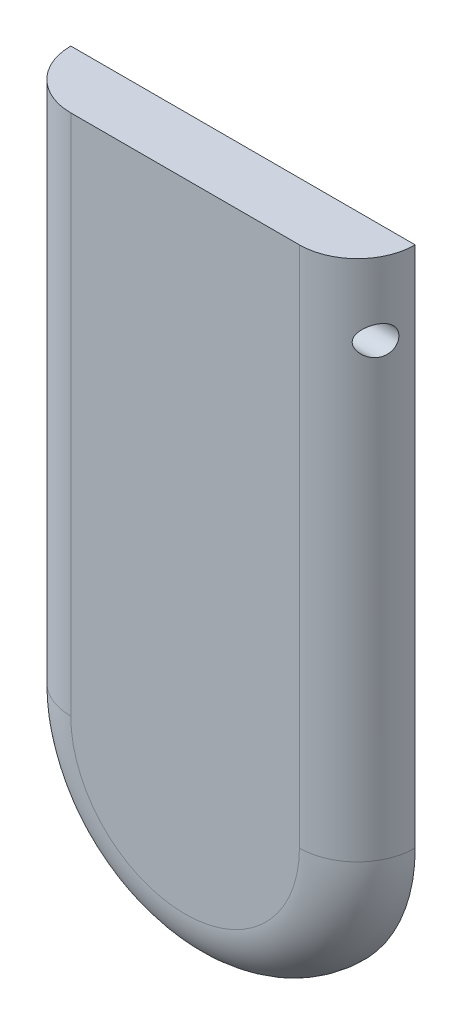
ISO-10303-21;
HEADER;
FILE_DESCRIPTION(('STEP AP214'),'2;1');
FILE_NAME('part.step','',(''),(''),'','','');
FILE_SCHEMA(('AUTOMOTIVE_DESIGN { 1 0 10303 214 1 1 1 1 }'));
ENDSEC;
DATA;
#1=APPLICATION_CONTEXT('core data for automotive mechanical design processes');
#2=APPLICATION_PROTOCOL_DEFINITION('international standard','automotive_design',2000,#1);
#3=PRODUCT_CONTEXT('',#1,'mechanical');
#4=PRODUCT('Part','Part','',(#3));
#5=PRODUCT_RELATED_PRODUCT_CATEGORY('part','',(#4));
#6=PRODUCT_DEFINITION_FORMATION('','',#4);
#7=PRODUCT_DEFINITION_CONTEXT('part definition',#1,'design');
#8=PRODUCT_DEFINITION('design','',#6,#7);
#9=PRODUCT_DEFINITION_SHAPE('','',#8);
#10=(LENGTH_UNIT() NAMED_UNIT(*) SI_UNIT(.MILLI.,.METRE.));
#11=(NAMED_UNIT(*) PLANE_ANGLE_UNIT() SI_UNIT($,.RADIAN.));
#12=(NAMED_UNIT(*) SI_UNIT($,.STERADIAN.) SOLID_ANGLE_UNIT());
#13=UNCERTAINTY_MEASURE_WITH_UNIT(LENGTH_MEASURE(1.E-05),#10,'distance_accuracy_value','');
#14=(GEOMETRIC_REPRESENTATION_CONTEXT(3) GLOBAL_UNCERTAINTY_ASSIGNED_CONTEXT((#13)) GLOBAL_UNIT_ASSIGNED_CONTEXT((#10,
#11,#12)) REPRESENTATION_CONTEXT('',''));
#15=CARTESIAN_POINT('',(0.,0.,0.));
#16=DIRECTION('',(0.,0.,1.));
#17=DIRECTION('',(1.,0.,0.));
#18=AXIS2_PLACEMENT_3D('',#15,#16,#17);
#19=CARTESIAN_POINT('',(0.,0.,10.));
#20=DIRECTION('',(0.,1.,0.));
#21=DIRECTION('',(-1.,0.,0.));
#22=AXIS2_PLACEMENT_3D('',#19,#20,#21);
#23=PLANE('',#22);
#24=DIRECTION('',(1.,0.,0.));
#25=VECTOR('',#24,1.);
#26=CARTESIAN_POINT('',(0.,0.,0.));
#27=LINE('',#26,#25);
#28=CARTESIAN_POINT('',(0.,0.,0.));
#29=VERTEX_POINT('',#28);
#30=CARTESIAN_POINT('',(59.5,0.,0.));
#31=VERTEX_POINT('',#30);
#32=EDGE_CURVE('E84',#29,#31,#27,.T.);
#33=ORIENTED_EDGE('',*,*,#32,.F.);
#34=CARTESIAN_POINT('',(10.,0.,0.));
#35=DIRECTION('',(0.,1.,0.));
#36=DIRECTION('',(-1.,0.,0.));
#37=AXIS2_PLACEMENT_3D('',#34,#35,#36);
#38=CIRCLE('',#37,10.);
#39=CARTESIAN_POINT('',(10.,0.,10.));
#40=VERTEX_POINT('',#39);
#41=EDGE_CURVE('E11',#29,#40,#38,.T.);
#42=ORIENTED_EDGE('',*,*,#41,.T.);
#43=DIRECTION('',(1.,0.,0.));
#44=VECTOR('',#43,1.);
#45=CARTESIAN_POINT('',(0.,0.,10.));
#46=LINE('',#45,#44);
#47=CARTESIAN_POINT('',(49.5,0.,10.));
#48=VERTEX_POINT('',#47);
#49=EDGE_CURVE('E87',#40,#48,#46,.T.);
#50=ORIENTED_EDGE('',*,*,#49,.T.);
#51=CARTESIAN_POINT('',(49.5,0.,0.));
#52=DIRECTION('',(0.,1.,0.));
#53=DIRECTION('',(-1.,0.,0.));
#54=AXIS2_PLACEMENT_3D('',#51,#52,#53);
#55=CIRCLE('',#54,10.);
#56=EDGE_CURVE('E47',#48,#31,#55,.T.);
#57=ORIENTED_EDGE('',*,*,#56,.T.);
#58=EDGE_LOOP('',(#33,#42,#50,#57));
#59=FACE_BOUND('',#58,.T.);
#60=ADVANCED_FACE('F33',(#59),#23,.T.);
#61=CARTESIAN_POINT('',(29.75,-90.25,10.));
#62=DIRECTION('',(0.,0.,1.));
#63=DIRECTION('',(1.,0.,0.));
#64=AXIS2_PLACEMENT_3D('',#61,#62,#63);
#65=PLANE('',#64);
#66=ORIENTED_EDGE('',*,*,#49,.F.);
#67=DIRECTION('',(0.,-1.,0.));
#68=VECTOR('',#67,1.);
#69=CARTESIAN_POINT('',(10.,-90.25,10.));
#70=LINE('',#69,#68);
#71=CARTESIAN_POINT('',(10.,-90.25,10.));
#72=VERTEX_POINT('',#71);
#73=EDGE_CURVE('E90',#40,#72,#70,.T.);
#74=ORIENTED_EDGE('',*,*,#73,.T.);
#75=CARTESIAN_POINT('',(29.75,-90.25,10.));
#76=DIRECTION('',(0.,0.,1.));
#77=DIRECTION('',(1.,0.,0.));
#78=AXIS2_PLACEMENT_3D('',#75,#76,#77);
#79=CIRCLE('',#78,19.75);
#80=CARTESIAN_POINT('',(49.5,-90.25,10.));
#81=VERTEX_POINT('',#80);
#82=EDGE_CURVE('E55',#72,#81,#79,.T.);
#83=ORIENTED_EDGE('',*,*,#82,.T.);
#84=DIRECTION('',(0.,-1.,0.));
#85=VECTOR('',#84,1.);
#86=CARTESIAN_POINT('',(49.5,-90.25,10.));
#87=LINE('',#86,#85);
#88=EDGE_CURVE('E110',#81,#48,#87,.F.);
#89=ORIENTED_EDGE('',*,*,#88,.T.);
#90=EDGE_LOOP('',(#66,#74,#83,#89));
#91=FACE_BOUND('',#90,.T.);
#92=ADVANCED_FACE('F134',(#91),#65,.T.);
#93=CARTESIAN_POINT('',(29.75,-90.25,0.));
#94=DIRECTION('',(0.,0.,1.));
#95=DIRECTION('',(1.,0.,0.));
#96=AXIS2_PLACEMENT_3D('',#93,#94,#95);
#97=PLANE('',#96);
#98=ORIENTED_EDGE('',*,*,#32,.T.);
#99=DIRECTION('',(0.,-1.,0.));
#100=VECTOR('',#99,1.);
#101=CARTESIAN_POINT('',(59.5,0.,0.));
#102=LINE('',#101,#100);
#103=CARTESIAN_POINT('',(59.5,-90.25,0.));
#104=VERTEX_POINT('',#103);
#105=EDGE_CURVE('E94',#31,#104,#102,.T.);
#106=ORIENTED_EDGE('',*,*,#105,.T.);
#107=CARTESIAN_POINT('',(29.75,-90.25,0.));
#108=DIRECTION('',(0.,0.,1.));
#109=DIRECTION('',(1.,0.,0.));
#110=AXIS2_PLACEMENT_3D('',#107,#108,#109);
#111=CIRCLE('',#110,29.75);
#112=CARTESIAN_POINT('',(0.,-90.25,0.));
#113=VERTEX_POINT('',#112);
#114=EDGE_CURVE('E103',#113,#104,#111,.T.);
#115=ORIENTED_EDGE('',*,*,#114,.F.);
#116=DIRECTION('',(0.,-1.,0.));
#117=VECTOR('',#116,1.);
#118=CARTESIAN_POINT('',(0.,0.,0.));
#119=LINE('',#118,#117);
#120=EDGE_CURVE('E96',#29,#113,#119,.T.);
#121=ORIENTED_EDGE('',*,*,#120,.F.);
#122=EDGE_LOOP('',(#98,#106,#115,#121));
#123=FACE_BOUND('',#122,.T.);
#124=ADVANCED_FACE('F93',(#123),#97,.F.);
#125=CARTESIAN_POINT('',(0.,-12.5,5.));
#126=DIRECTION('',(1.,0.,0.));
#127=DIRECTION('',(0.,1.,0.));
#128=AXIS2_PLACEMENT_3D('',#125,#126,#127);
#129=CYLINDRICAL_SURFACE('',#128,2.5);
#130=CARTESIAN_POINT('',(1.05987940679482,-14.945413246782,4.48042897264856));
#131=CARTESIAN_POINT('',(0.994028148303123,-14.91748824207,4.34902336259244));
#132=CARTESIAN_POINT('',(0.931983525336891,-14.8785391542313,4.21792886358789));
#133=CARTESIAN_POINT('',(0.816653598511713,-14.7778664839156,3.96056446968517));
#134=CARTESIAN_POINT('',(0.76337379755164,-14.7161286720802,3.83429764368121));
#135=CARTESIAN_POINT('',(0.666078025049096,-14.5699887235298,3.59097949836302));
#136=CARTESIAN_POINT('',(0.622092928464721,-14.4855131056338,3.47395967699344));
#137=CARTESIAN_POINT('',(0.543709069300681,-14.2956799201381,3.25456064041705));
#138=CARTESIAN_POINT('',(0.509307143647473,-14.1903292623621,3.15217659988965));
#139=CARTESIAN_POINT('',(0.451461646834753,-13.9686962968049,2.97217687890514));
#140=CARTESIAN_POINT('',(0.42747875515732,-13.85346886237,2.89343335168152));
#141=CARTESIAN_POINT('',(0.386960892698124,-13.6105047131829,2.75583863781248));
#142=CARTESIAN_POINT('',(0.370424882511313,-13.4827697472122,2.69698467534988));
#143=CARTESIAN_POINT('',(0.344554484486388,-13.22258245721,2.60282480959812));
#144=CARTESIAN_POINT('',(0.335019759904709,-13.0903849642254,2.56686810723234));
#145=CARTESIAN_POINT('',(0.321914407376719,-12.8216093066468,2.51700878098144));
#146=CARTESIAN_POINT('',(0.318343470728219,-12.6850313691698,2.50310501557705));
#147=CARTESIAN_POINT('',(0.316983485857283,-12.4121108273717,2.497838687993));
#148=CARTESIAN_POINT('',(0.31916516987436,-12.275770549721,2.50636202240123));
#149=CARTESIAN_POINT('',(0.329361784454931,-12.0065049557678,2.54541894949884));
#150=CARTESIAN_POINT('',(0.337376609416507,-11.8735795776878,2.57595214372639));
#151=CARTESIAN_POINT('',(0.359619406360098,-11.6149345791403,2.65797918841548));
#152=CARTESIAN_POINT('',(0.373846395876188,-11.4892138228032,2.70946972434525));
#153=CARTESIAN_POINT('',(0.409064633211984,-11.2484928185443,2.83160341378108));
#154=CARTESIAN_POINT('',(0.430055538355111,-11.1334920279032,2.90224559698888));
#155=CARTESIAN_POINT('',(0.479447787841247,-10.9169944210125,3.06038273780677));
#156=CARTESIAN_POINT('',(0.507870931672704,-10.8155386785496,3.14792707009057));
#157=CARTESIAN_POINT('',(0.572516883612841,-10.6290418780168,3.33653704159116));
#158=CARTESIAN_POINT('',(0.608739779478413,-10.544001004655,3.43760283293632));
#159=CARTESIAN_POINT('',(0.68991253245484,-10.3904833790493,3.65179762578683));
#160=CARTESIAN_POINT('',(0.735023143238465,-10.3223738574949,3.76512823999753));
#161=CARTESIAN_POINT('',(0.83319886592286,-10.2057826337408,3.99821898318103));
#162=CARTESIAN_POINT('',(0.886265754828174,-10.1573053252963,4.11798054463645));
#163=CARTESIAN_POINT('',(1.003229276085,-10.0774645702766,4.36787104181132));
#164=CARTESIAN_POINT('',(1.06759552029235,-10.0473603554445,4.49818006997711));
#165=CARTESIAN_POINT('',(1.20337335628127,-10.0082387308599,4.75824772137468));
#166=CARTESIAN_POINT('',(1.27478775855123,-9.99922976863908,4.88800610334717));
#167=CARTESIAN_POINT('',(1.43207886924341,-10.000970696237,5.15927413545926));
#168=CARTESIAN_POINT('',(1.5186663506097,-10.0141902142027,5.30035273676415));
#169=CARTESIAN_POINT('',(1.69680875396729,-10.0630828745267,5.57529547932706));
#170=CARTESIAN_POINT('',(1.78836697361786,-10.0987710934641,5.70915471083376));
#171=CARTESIAN_POINT('',(1.98813612133499,-10.1976475692352,5.98694322010017));
#172=CARTESIAN_POINT('',(2.09678713244677,-10.2641543659196,6.12937740006683));
#173=CARTESIAN_POINT('',(2.31397771048377,-10.4225895596824,6.39961885732443));
#174=CARTESIAN_POINT('',(2.42251716347666,-10.5145340070112,6.52741682746511));
#175=CARTESIAN_POINT('',(2.62167033882209,-10.7104887250239,6.75128950188052));
#176=CARTESIAN_POINT('',(2.71285769381814,-10.8116673347857,6.84933215205894));
#177=CARTESIAN_POINT('',(2.88672743788656,-11.033500687585,7.0297186775906));
#178=CARTESIAN_POINT('',(2.96942466096719,-11.1541204811169,7.11209015626536));
#179=CARTESIAN_POINT('',(3.09674416168973,-11.375711577517,7.23535895153976));
#180=CARTESIAN_POINT('',(3.14532121918584,-11.4716088379738,7.28126778539937));
#181=CARTESIAN_POINT('',(3.23167226410124,-11.6726589786864,7.36160397699545));
#182=CARTESIAN_POINT('',(3.2694635482878,-11.7777966821001,7.39604973256839));
#183=CARTESIAN_POINT('',(3.32548792554142,-11.9776390647438,7.44661558712308));
#184=CARTESIAN_POINT('',(3.34592404035388,-12.0711863198266,7.46482633607299));
#185=CARTESIAN_POINT('',(3.3747803759506,-12.2615578500406,7.4904506181837));
#186=CARTESIAN_POINT('',(3.38321061078104,-12.3583793250626,7.49787314985059));
#187=CARTESIAN_POINT('',(3.38713619864913,-12.5526968152861,7.50133604498708));
#188=CARTESIAN_POINT('',(3.3826051421731,-12.6501938033428,7.49735316914448));
#189=CARTESIAN_POINT('',(3.36107564177232,-12.8426933094326,7.47829375592313));
#190=CARTESIAN_POINT('',(3.34406842351159,-12.9376940231346,7.46320941098918));
#191=CARTESIAN_POINT('',(3.29477734159391,-13.1414629225742,7.41898089318143));
#192=CARTESIAN_POINT('',(3.26011147241057,-13.2491645581498,7.38762153061496));
#193=CARTESIAN_POINT('',(3.17900099000379,-13.4555518726077,7.31279782273326));
#194=CARTESIAN_POINT('',(3.13253342780209,-13.554219469863,7.26930987643161));
#195=CARTESIAN_POINT('',(3.01135028981312,-13.7788371629884,7.15319913650021));
#196=CARTESIAN_POINT('',(2.93272018811096,-13.9002092365847,7.07584918386866));
#197=CARTESIAN_POINT('',(2.76634934809232,-14.1242510524074,6.90568821449608));
#198=CARTESIAN_POINT('',(2.6785979764923,-14.2268985734432,6.81285907472509));
#199=CARTESIAN_POINT('',(2.4956405778684,-14.4170028843438,6.61088170991247));
#200=CARTESIAN_POINT('',(2.40028423382981,-14.503848245689,6.50129681183536));
#201=CARTESIAN_POINT('',(2.20835219276505,-14.6578743007818,6.26999628845262));
#202=CARTESIAN_POINT('',(2.11177587020162,-14.7250444406439,6.14827419944749));
#203=CARTESIAN_POINT('',(1.89938701680508,-14.8510917051919,5.86664411543181));
#204=CARTESIAN_POINT('',(1.78395457571379,-14.9049952746945,5.70418585815381));
#205=CARTESIAN_POINT('',(1.56009015685605,-14.9788338952371,5.36736123399828));
#206=CARTESIAN_POINT('',(1.45164344269154,-14.9988428659317,5.19302164541559));
#207=CARTESIAN_POINT('',(1.29760056295837,-15.0005026993657,4.92734658016539));
#208=CARTESIAN_POINT('',(1.24782830531054,-14.9963851379232,4.83836899912461));
#209=CARTESIAN_POINT('',(1.15140773061797,-14.9783564980051,4.65968911189588));
#210=CARTESIAN_POINT('',(1.10475949094284,-14.9644451770749,4.56998678782053));
#211=CARTESIAN_POINT('',(1.05987940679482,-14.945413246782,4.48042897264856));
#212=B_SPLINE_CURVE_WITH_KNOTS('',3,(#130,#131,#132,#133,#134,#135,#136,#137,#138,#139,#140,
#141,#142,#143,#144,#145,#146,#147,#148,#149,#150,#151,#152,#153,#154,#155,#156,#157,#158,#159,
#160,#161,#162,#163,#164,#165,#166,#167,#168,#169,#170,#171,#172,#173,#174,#175,#176,#177,#178,
#179,#180,#181,#182,#183,#184,#185,#186,#187,#188,#189,#190,#191,#192,#193,#194,#195,#196,#197,
#198,#199,#200,#201,#202,#203,#204,#205,#206,#207,#208,#209,#210,#211),.UNSPECIFIED.,.T.,.F.,(4,
2,2,2,2,2,2,2,2,2,2,2,2,2,2,2,2,2,2,2,2,2,2,2,2,2,2,2,2,2,2,2,2,2,2,2,2,2,2,2,4),(0.,
0.44850067536028,0.897281871134208,1.34753116596671,1.79763167250331,2.22035117777879,
2.64301166330636,3.05304877711941,3.46306466561729,3.87099853542732,4.27892502027461,
4.68678701410739,5.09462834789776,5.50367960699154,5.91273546866028,6.33001201214945,
6.7473818919897,7.19084190790754,7.63447947573069,8.13072250244321,8.62729886541746,
9.19825879968105,9.76957981414872,10.271346663248,10.7722213434139,11.1217671314634,
11.4707491743381,11.7619125572655,12.052832939706,12.3443465142084,12.6360653035265,
12.9863680317822,13.3373572273902,13.8267096032032,14.3166389880825,14.8226992549528,
15.3290304800127,15.9453841934812,16.5603919818771,16.8660543214967,17.1717242283695),.UNSPECIFIED.);
#213=CARTESIAN_POINT('',(1.05987940679482,-14.945413246782,4.48042897264856));
#214=VERTEX_POINT('',#213);
#215=EDGE_CURVE('E97',#214,#214,#212,.T.);
#216=ORIENTED_EDGE('',*,*,#215,.F.);
#217=EDGE_LOOP('',(#216));
#218=FACE_BOUND('',#217,.T.);
#219=CARTESIAN_POINT('',(58.4401205932052,-14.945413246782,4.48042897264856));
#220=CARTESIAN_POINT('',(58.5059718516969,-14.91748824207,4.34902336259244));
#221=CARTESIAN_POINT('',(58.5680164746631,-14.8785391542313,4.21792886358789));
#222=CARTESIAN_POINT('',(58.6833464014883,-14.7778664839156,3.96056446968517));
#223=CARTESIAN_POINT('',(58.7366262024484,-14.7161286720802,3.83429764368121));
#224=CARTESIAN_POINT('',(58.8339219749509,-14.5699887235297,3.59097949836302));
#225=CARTESIAN_POINT('',(58.8779070715353,-14.4855131056337,3.47395967699344));
#226=CARTESIAN_POINT('',(58.9562909306993,-14.2956799201381,3.25456064041704));
#227=CARTESIAN_POINT('',(58.9906928563525,-14.190329262362,3.15217659988965));
#228=CARTESIAN_POINT('',(59.0485383531652,-13.9686962968049,2.97217687890514));
#229=CARTESIAN_POINT('',(59.0725212448427,-13.85346886237,2.89343335168152));
#230=CARTESIAN_POINT('',(59.1130391073019,-13.6105047131829,2.75583863781247));
#231=CARTESIAN_POINT('',(59.1295751174887,-13.4827697472122,2.69698467534988));
#232=CARTESIAN_POINT('',(59.1554455155136,-13.22258245721,2.60282480959812));
#233=CARTESIAN_POINT('',(59.1649802400953,-13.0903849642253,2.56686810723234));
#234=CARTESIAN_POINT('',(59.1780855926233,-12.8216093066468,2.51700878098144));
#235=CARTESIAN_POINT('',(59.1816565292718,-12.6850313691698,2.50310501557705));
#236=CARTESIAN_POINT('',(59.1830165141427,-12.4121108273717,2.497838687993));
#237=CARTESIAN_POINT('',(59.1808348301256,-12.275770549721,2.50636202240123));
#238=CARTESIAN_POINT('',(59.1706382155451,-12.0065049557678,2.54541894949884));
#239=CARTESIAN_POINT('',(59.1626233905835,-11.8735795776878,2.57595214372639));
#240=CARTESIAN_POINT('',(59.1403805936399,-11.6149345791403,2.65797918841548));
#241=CARTESIAN_POINT('',(59.1261536041238,-11.4892138228032,2.70946972434525));
#242=CARTESIAN_POINT('',(59.090935366788,-11.2484928185443,2.83160341378108));
#243=CARTESIAN_POINT('',(59.0699444616449,-11.1334920279032,2.90224559698888));
#244=CARTESIAN_POINT('',(59.0205522121588,-10.9169944210125,3.06038273780677));
#245=CARTESIAN_POINT('',(58.9921290683273,-10.8155386785496,3.14792707009057));
#246=CARTESIAN_POINT('',(58.9274831163872,-10.6290418780168,3.33653704159117));
#247=CARTESIAN_POINT('',(58.8912602205216,-10.544001004655,3.43760283293632));
#248=CARTESIAN_POINT('',(58.8100874675452,-10.3904833790493,3.65179762578683));
#249=CARTESIAN_POINT('',(58.7649768567615,-10.3223738574949,3.76512823999753));
#250=CARTESIAN_POINT('',(58.6668011340771,-10.2057826337408,3.99821898318104));
#251=CARTESIAN_POINT('',(58.6137342451718,-10.1573053252963,4.11798054463645));
#252=CARTESIAN_POINT('',(58.496770723915,-10.0774645702766,4.36787104181132));
#253=CARTESIAN_POINT('',(58.4324044797076,-10.0473603554445,4.49818006997711));
#254=CARTESIAN_POINT('',(58.2966266437187,-10.0082387308599,4.75824772137468));
#255=CARTESIAN_POINT('',(58.2252122414488,-9.99922976863907,4.88800610334717));
#256=CARTESIAN_POINT('',(58.0679211307566,-10.0009706962369,5.15927413545926));
#257=CARTESIAN_POINT('',(57.9813336493903,-10.0141902142027,5.30035273676415));
#258=CARTESIAN_POINT('',(57.8031912460327,-10.0630828745267,5.57529547932706));
#259=CARTESIAN_POINT('',(57.7116330263821,-10.0987710934641,5.70915471083377));
#260=CARTESIAN_POINT('',(57.511863878665,-10.1976475692352,5.98694322010017));
#261=CARTESIAN_POINT('',(57.4032128675532,-10.2641543659196,6.12937740006684));
#262=CARTESIAN_POINT('',(57.1860222895162,-10.4225895596824,6.39961885732443));
#263=CARTESIAN_POINT('',(57.0774828365233,-10.5145340070112,6.52741682746511));
#264=CARTESIAN_POINT('',(56.8783296611779,-10.7104887250238,6.75128950188052));
#265=CARTESIAN_POINT('',(56.7871423061819,-10.8116673347857,6.84933215205894));
#266=CARTESIAN_POINT('',(56.6132725621134,-11.033500687585,7.02971867759061));
#267=CARTESIAN_POINT('',(56.5305753390328,-11.1541204811169,7.11209015626536));
#268=CARTESIAN_POINT('',(56.4032558383103,-11.375711577517,7.23535895153976));
#269=CARTESIAN_POINT('',(56.3546787808142,-11.4716088379738,7.28126778539937));
#270=CARTESIAN_POINT('',(56.2683277358988,-11.6726589786864,7.36160397699545));
#271=CARTESIAN_POINT('',(56.2305364517122,-11.7777966821001,7.39604973256839));
#272=CARTESIAN_POINT('',(56.1745120744586,-11.9776390647437,7.44661558712308));
#273=CARTESIAN_POINT('',(56.1540759596461,-12.0711863198266,7.46482633607299));
#274=CARTESIAN_POINT('',(56.1252196240494,-12.2615578500406,7.4904506181837));
#275=CARTESIAN_POINT('',(56.116789389219,-12.3583793250626,7.49787314985059));
#276=CARTESIAN_POINT('',(56.1128638013509,-12.552696815286,7.50133604498708));
#277=CARTESIAN_POINT('',(56.1173948578269,-12.6501938033428,7.49735316914448));
#278=CARTESIAN_POINT('',(56.1389243582277,-12.8426933094326,7.47829375592313));
#279=CARTESIAN_POINT('',(56.1559315764884,-12.9376940231346,7.46320941098918));
#280=CARTESIAN_POINT('',(56.2052226584061,-13.1414629225742,7.41898089318143));
#281=CARTESIAN_POINT('',(56.2398885275894,-13.2491645581498,7.38762153061496));
#282=CARTESIAN_POINT('',(56.3209990099962,-13.4555518726077,7.31279782273326));
#283=CARTESIAN_POINT('',(56.3674665721979,-13.554219469863,7.26930987643161));
#284=CARTESIAN_POINT('',(56.4886497101869,-13.7788371629884,7.15319913650021));
#285=CARTESIAN_POINT('',(56.567279811889,-13.9002092365847,7.07584918386865));
#286=CARTESIAN_POINT('',(56.7336506519077,-14.1242510524074,6.90568821449607));
#287=CARTESIAN_POINT('',(56.8214020235077,-14.2268985734432,6.81285907472508));
#288=CARTESIAN_POINT('',(57.0043594221316,-14.4170028843438,6.61088170991246));
#289=CARTESIAN_POINT('',(57.0997157661702,-14.5038482456889,6.50129681183535));
#290=CARTESIAN_POINT('',(57.291647807235,-14.6578743007818,6.26999628845261));
#291=CARTESIAN_POINT('',(57.3882241297984,-14.7250444406439,6.14827419944748));
#292=CARTESIAN_POINT('',(57.6006129831949,-14.8510917051919,5.8666441154318));
#293=CARTESIAN_POINT('',(57.7160454242862,-14.9049952746945,5.70418585815381));
#294=CARTESIAN_POINT('',(57.939909843144,-14.978833895237,5.36736123399827));
#295=CARTESIAN_POINT('',(58.0483565573085,-14.9988428659316,5.19302164541557));
#296=CARTESIAN_POINT('',(58.2023994370416,-15.0005026993656,4.92734658016538));
#297=CARTESIAN_POINT('',(58.2521716946895,-14.9963851379231,4.83836899912459));
#298=CARTESIAN_POINT('',(58.348592269382,-14.9783564980051,4.65968911189587));
#299=CARTESIAN_POINT('',(58.3952405090572,-14.9644451770748,4.56998678782052));
#300=CARTESIAN_POINT('',(58.4401205932052,-14.945413246782,4.48042897264856));
#301=B_SPLINE_CURVE_WITH_KNOTS('',3,(#219,#220,#221,#222,#223,#224,#225,#226,#227,#228,#229,
#230,#231,#232,#233,#234,#235,#236,#237,#238,#239,#240,#241,#242,#243,#244,#245,#246,#247,#248,
#249,#250,#251,#252,#253,#254,#255,#256,#257,#258,#259,#260,#261,#262,#263,#264,#265,#266,#267,
#268,#269,#270,#271,#272,#273,#274,#275,#276,#277,#278,#279,#280,#281,#282,#283,#284,#285,#286,
#287,#288,#289,#290,#291,#292,#293,#294,#295,#296,#297,#298,#299,#300),.UNSPECIFIED.,.T.,.F.,(4,
2,2,2,2,2,2,2,2,2,2,2,2,2,2,2,2,2,2,2,2,2,2,2,2,2,2,2,2,2,2,2,2,2,2,2,2,2,2,2,4),(0.,
0.448500675360277,0.897281871134204,1.3475311659667,1.79763167250331,2.22035117777879,
2.64301166330636,3.05304877711941,3.46306466561729,3.87099853542731,4.27892502027461,
4.68678701410739,5.09462834789776,5.50367960699153,5.91273546866028,6.33001201214945,
6.7473818919897,7.19084190790754,7.63447947573069,8.13072250244321,8.62729886541746,
9.19825879968105,9.76957981414872,10.271346663248,10.7722213434139,11.1217671314634,
11.4707491743381,11.7619125572655,12.052832939706,12.3443465142084,12.6360653035265,
12.9863680317823,13.3373572273902,13.8267096032032,14.3166389880826,14.8226992549528,
15.3290304800127,15.9453841934812,16.5603919818771,16.8660543214967,17.1717242283694),.UNSPECIFIED.);
#302=CARTESIAN_POINT('',(58.4401205932052,-14.945413246782,4.48042897264856));
#303=VERTEX_POINT('',#302);
#304=EDGE_CURVE('E38',#303,#303,#301,.T.);
#305=ORIENTED_EDGE('',*,*,#304,.T.);
#306=EDGE_LOOP('',(#305));
#307=FACE_BOUND('',#306,.T.);
#308=ADVANCED_FACE('F119',(#218,#307),#129,.F.);
#309=CARTESIAN_POINT('',(49.5,0.,0.));
#310=DIRECTION('',(0.,-1.,0.));
#311=DIRECTION('',(1.,0.,0.));
#312=AXIS2_PLACEMENT_3D('',#309,#310,#311);
#313=CYLINDRICAL_SURFACE('',#312,10.);
#314=ORIENTED_EDGE('',*,*,#56,.F.);
#315=ORIENTED_EDGE('',*,*,#88,.F.);
#316=CARTESIAN_POINT('',(49.5,-90.25,0.));
#317=DIRECTION('',(0.,-1.,0.));
#318=DIRECTION('',(0.,0.,-1.));
#319=AXIS2_PLACEMENT_3D('',#316,#317,#318);
#320=CIRCLE('',#319,10.);
#321=EDGE_CURVE('E101',#104,#81,#320,.T.);
#322=ORIENTED_EDGE('',*,*,#321,.F.);
#323=ORIENTED_EDGE('',*,*,#105,.F.);
#324=EDGE_LOOP('',(#314,#315,#322,#323));
#325=FACE_BOUND('',#324,.T.);
#326=ORIENTED_EDGE('',*,*,#304,.F.);
#327=EDGE_LOOP('',(#326));
#328=FACE_BOUND('',#327,.T.);
#329=ADVANCED_FACE('F35',(#325,#328),#313,.T.);
#330=CARTESIAN_POINT('',(29.75,-90.25,0.));
#331=DIRECTION('',(0.,0.,1.));
#332=DIRECTION('',(1.,0.,0.));
#333=AXIS2_PLACEMENT_3D('',#330,#331,#332);
#334=TOROIDAL_SURFACE('',#333,19.75,10.);
#335=ORIENTED_EDGE('',*,*,#321,.T.);
#336=ORIENTED_EDGE('',*,*,#82,.F.);
#337=CARTESIAN_POINT('',(10.,-90.25,0.));
#338=DIRECTION('',(0.,1.,0.));
#339=DIRECTION('',(0.,0.,1.));
#340=AXIS2_PLACEMENT_3D('',#337,#338,#339);
#341=CIRCLE('',#340,10.);
#342=EDGE_CURVE('E63',#113,#72,#341,.T.);
#343=ORIENTED_EDGE('',*,*,#342,.F.);
#344=ORIENTED_EDGE('',*,*,#114,.T.);
#345=EDGE_LOOP('',(#335,#336,#343,#344));
#346=FACE_BOUND('',#345,.T.);
#347=ADVANCED_FACE('F126',(#346),#334,.T.);
#348=CARTESIAN_POINT('',(10.,-90.25,0.));
#349=DIRECTION('',(0.,1.,0.));
#350=DIRECTION('',(-1.,0.,0.));
#351=AXIS2_PLACEMENT_3D('',#348,#349,#350);
#352=CYLINDRICAL_SURFACE('',#351,10.);
#353=ORIENTED_EDGE('',*,*,#41,.F.);
#354=ORIENTED_EDGE('',*,*,#120,.T.);
#355=ORIENTED_EDGE('',*,*,#342,.T.);
#356=ORIENTED_EDGE('',*,*,#73,.F.);
#357=EDGE_LOOP('',(#353,#354,#355,#356));
#358=FACE_BOUND('',#357,.T.);
#359=ORIENTED_EDGE('',*,*,#215,.T.);
#360=EDGE_LOOP('',(#359));
#361=FACE_BOUND('',#360,.T.);
#362=ADVANCED_FACE('F122',(#358,#361),#352,.T.);
#363=CLOSED_SHELL('',(#60,#92,#124,#308,#329,#347,#362));
#364=MANIFOLD_SOLID_BREP('B2',#363);
#365=ADVANCED_BREP_SHAPE_REPRESENTATION('',(#18,#364),#14);
#366=SHAPE_DEFINITION_REPRESENTATION(#9,#365);
ENDSEC;
END-ISO-10303-21;
